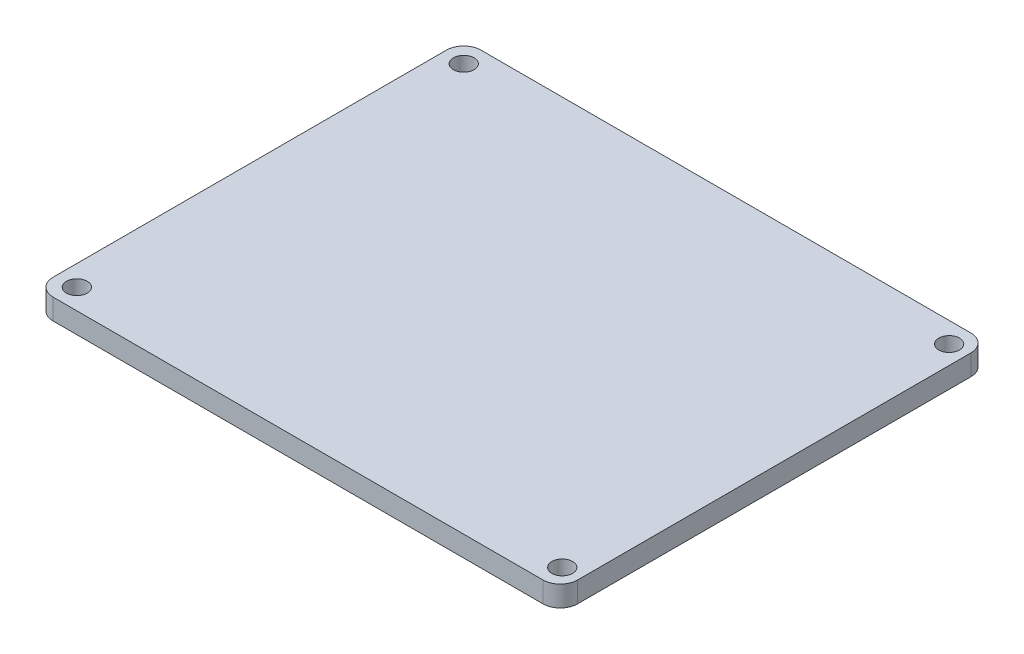
ISO-10303-21;
HEADER;
FILE_DESCRIPTION(('STEP AP214'),'2;1');
FILE_NAME('part.step','',(''),(''),'','','');
FILE_SCHEMA(('AUTOMOTIVE_DESIGN { 1 0 10303 214 1 1 1 1 }'));
ENDSEC;
DATA;
#1=APPLICATION_CONTEXT('core data for automotive mechanical design processes');
#2=APPLICATION_PROTOCOL_DEFINITION('international standard','automotive_design',2000,#1);
#3=PRODUCT_CONTEXT('',#1,'mechanical');
#4=PRODUCT('Part','Part','',(#3));
#5=PRODUCT_RELATED_PRODUCT_CATEGORY('part','',(#4));
#6=PRODUCT_DEFINITION_FORMATION('','',#4);
#7=PRODUCT_DEFINITION_CONTEXT('part definition',#1,'design');
#8=PRODUCT_DEFINITION('design','',#6,#7);
#9=PRODUCT_DEFINITION_SHAPE('','',#8);
#10=(LENGTH_UNIT() NAMED_UNIT(*) SI_UNIT(.MILLI.,.METRE.));
#11=(NAMED_UNIT(*) PLANE_ANGLE_UNIT() SI_UNIT($,.RADIAN.));
#12=(NAMED_UNIT(*) SI_UNIT($,.STERADIAN.) SOLID_ANGLE_UNIT());
#13=UNCERTAINTY_MEASURE_WITH_UNIT(LENGTH_MEASURE(1.E-05),#10,'distance_accuracy_value','');
#14=(GEOMETRIC_REPRESENTATION_CONTEXT(3) GLOBAL_UNCERTAINTY_ASSIGNED_CONTEXT((#13)) GLOBAL_UNIT_ASSIGNED_CONTEXT((#10,
#11,#12)) REPRESENTATION_CONTEXT('',''));
#15=CARTESIAN_POINT('',(0.,0.,0.));
#16=DIRECTION('',(0.,0.,1.));
#17=DIRECTION('',(1.,0.,0.));
#18=AXIS2_PLACEMENT_3D('',#15,#16,#17);
#19=CARTESIAN_POINT('',(-35.6428674078408,3.,28.5));
#20=DIRECTION('',(0.,1.,0.));
#21=DIRECTION('',(0.,0.,1.));
#22=AXIS2_PLACEMENT_3D('',#19,#20,#21);
#23=PLANE('',#22);
#24=CARTESIAN_POINT('',(35.1695408590477,3.,28.034184865455));
#25=DIRECTION('',(0.,1.,0.));
#26=DIRECTION('',(0.,0.,1.));
#27=AXIS2_PLACEMENT_3D('',#24,#25,#26);
#28=CIRCLE('',#27,1.5);
#29=CARTESIAN_POINT('',(35.1695408590477,3.,29.534184865455));
#30=VERTEX_POINT('',#29);
#31=EDGE_CURVE('E187',#30,#30,#28,.T.);
#32=ORIENTED_EDGE('',*,*,#31,.F.);
#33=EDGE_LOOP('',(#32));
#34=FACE_BOUND('',#33,.T.);
#35=CARTESIAN_POINT('',(-35.1695408590477,3.,-28.034184865455));
#36=DIRECTION('',(0.,1.,0.));
#37=DIRECTION('',(0.,0.,1.));
#38=AXIS2_PLACEMENT_3D('',#35,#36,#37);
#39=CIRCLE('',#38,1.5);
#40=CARTESIAN_POINT('',(-35.1695408590477,3.,-26.534184865455));
#41=VERTEX_POINT('',#40);
#42=EDGE_CURVE('E133',#41,#41,#39,.T.);
#43=ORIENTED_EDGE('',*,*,#42,.F.);
#44=EDGE_LOOP('',(#43));
#45=FACE_BOUND('',#44,.T.);
#46=CARTESIAN_POINT('',(-35.6428674078408,3.,28.5));
#47=DIRECTION('',(0.,1.,0.));
#48=DIRECTION('',(0.,0.,1.));
#49=AXIS2_PLACEMENT_3D('',#46,#47,#48);
#50=CIRCLE('',#49,2.5);
#51=CARTESIAN_POINT('',(-38.1428674078408,3.,28.5));
#52=VERTEX_POINT('',#51);
#53=CARTESIAN_POINT('',(-35.6428674078408,3.,31.));
#54=VERTEX_POINT('',#53);
#55=EDGE_CURVE('E144',#52,#54,#50,.T.);
#56=ORIENTED_EDGE('',*,*,#55,.T.);
#57=DIRECTION('',(1.,0.,0.));
#58=VECTOR('',#57,1.);
#59=CARTESIAN_POINT('',(-35.6428674078408,3.,31.));
#60=LINE('',#59,#58);
#61=CARTESIAN_POINT('',(35.3571325921592,3.,31.));
#62=VERTEX_POINT('',#61);
#63=EDGE_CURVE('E92',#54,#62,#60,.T.);
#64=ORIENTED_EDGE('',*,*,#63,.T.);
#65=CARTESIAN_POINT('',(35.3571325921592,3.,28.5));
#66=DIRECTION('',(0.,1.,0.));
#67=DIRECTION('',(0.,0.,1.));
#68=AXIS2_PLACEMENT_3D('',#65,#66,#67);
#69=CIRCLE('',#68,2.5);
#70=CARTESIAN_POINT('',(37.8571325921592,3.,28.5));
#71=VERTEX_POINT('',#70);
#72=EDGE_CURVE('E159',#62,#71,#69,.T.);
#73=ORIENTED_EDGE('',*,*,#72,.T.);
#74=DIRECTION('',(0.,0.,-1.));
#75=VECTOR('',#74,1.);
#76=CARTESIAN_POINT('',(37.8571325921592,3.,-28.5));
#77=LINE('',#76,#75);
#78=CARTESIAN_POINT('',(37.8571325921592,3.,-28.5));
#79=VERTEX_POINT('',#78);
#80=EDGE_CURVE('E172',#71,#79,#77,.T.);
#81=ORIENTED_EDGE('',*,*,#80,.T.);
#82=CARTESIAN_POINT('',(35.3571325921592,3.,-28.5));
#83=DIRECTION('',(0.,1.,0.));
#84=DIRECTION('',(0.,0.,-1.));
#85=AXIS2_PLACEMENT_3D('',#82,#83,#84);
#86=CIRCLE('',#85,2.5);
#87=CARTESIAN_POINT('',(35.3571325921592,3.,-31.));
#88=VERTEX_POINT('',#87);
#89=EDGE_CURVE('E111',#79,#88,#86,.T.);
#90=ORIENTED_EDGE('',*,*,#89,.T.);
#91=DIRECTION('',(-1.,0.,0.));
#92=VECTOR('',#91,1.);
#93=CARTESIAN_POINT('',(-35.6428674078408,3.,-31.));
#94=LINE('',#93,#92);
#95=CARTESIAN_POINT('',(-35.6428674078408,3.,-31.));
#96=VERTEX_POINT('',#95);
#97=EDGE_CURVE('E105',#88,#96,#94,.T.);
#98=ORIENTED_EDGE('',*,*,#97,.T.);
#99=CARTESIAN_POINT('',(-35.6428674078408,3.,-28.5));
#100=DIRECTION('',(0.,1.,0.));
#101=DIRECTION('',(0.,0.,1.));
#102=AXIS2_PLACEMENT_3D('',#99,#100,#101);
#103=CIRCLE('',#102,2.5);
#104=CARTESIAN_POINT('',(-38.1428674078408,3.,-28.5));
#105=VERTEX_POINT('',#104);
#106=EDGE_CURVE('E109',#96,#105,#103,.T.);
#107=ORIENTED_EDGE('',*,*,#106,.T.);
#108=DIRECTION('',(0.,0.,1.));
#109=VECTOR('',#108,1.);
#110=CARTESIAN_POINT('',(-38.1428674078408,3.,-28.5));
#111=LINE('',#110,#109);
#112=EDGE_CURVE('E49',#105,#52,#111,.T.);
#113=ORIENTED_EDGE('',*,*,#112,.T.);
#114=EDGE_LOOP('',(#56,#64,#73,#81,#90,#98,#107,#113));
#115=FACE_BOUND('',#114,.T.);
#116=CARTESIAN_POINT('',(35.1695408590477,3.,-28.034184865455));
#117=DIRECTION('',(0.,1.,0.));
#118=DIRECTION('',(0.,0.,-1.));
#119=AXIS2_PLACEMENT_3D('',#116,#117,#118);
#120=CIRCLE('',#119,1.5);
#121=CARTESIAN_POINT('',(35.1695408590477,3.,-29.534184865455));
#122=VERTEX_POINT('',#121);
#123=EDGE_CURVE('E181',#122,#122,#120,.T.);
#124=ORIENTED_EDGE('',*,*,#123,.F.);
#125=EDGE_LOOP('',(#124));
#126=FACE_BOUND('',#125,.T.);
#127=CARTESIAN_POINT('',(-35.1695408590477,3.,28.034184865455));
#128=DIRECTION('',(0.,1.,0.));
#129=DIRECTION('',(0.,0.,-1.));
#130=AXIS2_PLACEMENT_3D('',#127,#128,#129);
#131=CIRCLE('',#130,1.5);
#132=CARTESIAN_POINT('',(-35.1695408590477,3.,26.534184865455));
#133=VERTEX_POINT('',#132);
#134=EDGE_CURVE('E193',#133,#133,#131,.T.);
#135=ORIENTED_EDGE('',*,*,#134,.F.);
#136=EDGE_LOOP('',(#135));
#137=FACE_BOUND('',#136,.T.);
#138=ADVANCED_FACE('F32',(#34,#45,#115,#126,#137),#23,.T.);
#139=CARTESIAN_POINT('',(-35.6428674078408,0.,28.5));
#140=DIRECTION('',(0.,1.,0.));
#141=DIRECTION('',(0.,0.,1.));
#142=AXIS2_PLACEMENT_3D('',#139,#140,#141);
#143=PLANE('',#142);
#144=CARTESIAN_POINT('',(-35.6428674078408,0.,28.5));
#145=DIRECTION('',(0.,1.,0.));
#146=DIRECTION('',(0.,0.,1.));
#147=AXIS2_PLACEMENT_3D('',#144,#145,#146);
#148=CIRCLE('',#147,2.5);
#149=CARTESIAN_POINT('',(-38.1428674078408,0.,28.5));
#150=VERTEX_POINT('',#149);
#151=CARTESIAN_POINT('',(-35.6428674078408,0.,31.));
#152=VERTEX_POINT('',#151);
#153=EDGE_CURVE('E129',#150,#152,#148,.T.);
#154=ORIENTED_EDGE('',*,*,#153,.F.);
#155=DIRECTION('',(0.,0.,1.));
#156=VECTOR('',#155,1.);
#157=CARTESIAN_POINT('',(-38.1428674078408,0.,-28.5));
#158=LINE('',#157,#156);
#159=CARTESIAN_POINT('',(-38.1428674078408,0.,-28.5));
#160=VERTEX_POINT('',#159);
#161=EDGE_CURVE('E84',#160,#150,#158,.T.);
#162=ORIENTED_EDGE('',*,*,#161,.F.);
#163=CARTESIAN_POINT('',(-35.6428674078408,0.,-28.5));
#164=DIRECTION('',(0.,1.,0.));
#165=DIRECTION('',(0.,0.,1.));
#166=AXIS2_PLACEMENT_3D('',#163,#164,#165);
#167=CIRCLE('',#166,2.5);
#168=CARTESIAN_POINT('',(-35.6428674078408,0.,-31.));
#169=VERTEX_POINT('',#168);
#170=EDGE_CURVE('E78',#169,#160,#167,.T.);
#171=ORIENTED_EDGE('',*,*,#170,.F.);
#172=DIRECTION('',(-1.,0.,0.));
#173=VECTOR('',#172,1.);
#174=CARTESIAN_POINT('',(-35.6428674078408,0.,-31.));
#175=LINE('',#174,#173);
#176=CARTESIAN_POINT('',(35.3571325921592,0.,-31.));
#177=VERTEX_POINT('',#176);
#178=EDGE_CURVE('E119',#177,#169,#175,.T.);
#179=ORIENTED_EDGE('',*,*,#178,.F.);
#180=CARTESIAN_POINT('',(35.3571325921592,0.,-28.5));
#181=DIRECTION('',(0.,1.,0.));
#182=DIRECTION('',(0.,0.,-1.));
#183=AXIS2_PLACEMENT_3D('',#180,#181,#182);
#184=CIRCLE('',#183,2.5);
#185=CARTESIAN_POINT('',(37.8571325921592,0.,-28.5));
#186=VERTEX_POINT('',#185);
#187=EDGE_CURVE('E139',#186,#177,#184,.T.);
#188=ORIENTED_EDGE('',*,*,#187,.F.);
#189=DIRECTION('',(0.,0.,-1.));
#190=VECTOR('',#189,1.);
#191=CARTESIAN_POINT('',(37.8571325921592,0.,-28.5));
#192=LINE('',#191,#190);
#193=CARTESIAN_POINT('',(37.8571325921592,0.,28.5));
#194=VERTEX_POINT('',#193);
#195=EDGE_CURVE('E137',#194,#186,#192,.T.);
#196=ORIENTED_EDGE('',*,*,#195,.F.);
#197=CARTESIAN_POINT('',(35.3571325921592,0.,28.5));
#198=DIRECTION('',(0.,1.,0.));
#199=DIRECTION('',(0.,0.,1.));
#200=AXIS2_PLACEMENT_3D('',#197,#198,#199);
#201=CIRCLE('',#200,2.5);
#202=CARTESIAN_POINT('',(35.3571325921592,0.,31.));
#203=VERTEX_POINT('',#202);
#204=EDGE_CURVE('E135',#203,#194,#201,.T.);
#205=ORIENTED_EDGE('',*,*,#204,.F.);
#206=DIRECTION('',(1.,0.,0.));
#207=VECTOR('',#206,1.);
#208=CARTESIAN_POINT('',(-35.6428674078408,0.,31.));
#209=LINE('',#208,#207);
#210=EDGE_CURVE('E132',#152,#203,#209,.T.);
#211=ORIENTED_EDGE('',*,*,#210,.F.);
#212=EDGE_LOOP('',(#154,#162,#171,#179,#188,#196,#205,#211));
#213=FACE_BOUND('',#212,.T.);
#214=CARTESIAN_POINT('',(-35.1695408590477,0.,-28.034184865455));
#215=DIRECTION('',(0.,1.,0.));
#216=DIRECTION('',(0.,0.,1.));
#217=AXIS2_PLACEMENT_3D('',#214,#215,#216);
#218=CIRCLE('',#217,1.5);
#219=CARTESIAN_POINT('',(-35.1695408590477,0.,-26.534184865455));
#220=VERTEX_POINT('',#219);
#221=EDGE_CURVE('E178',#220,#220,#218,.T.);
#222=ORIENTED_EDGE('',*,*,#221,.T.);
#223=EDGE_LOOP('',(#222));
#224=FACE_BOUND('',#223,.T.);
#225=CARTESIAN_POINT('',(35.1695408590477,0.,-28.034184865455));
#226=DIRECTION('',(0.,1.,0.));
#227=DIRECTION('',(0.,0.,-1.));
#228=AXIS2_PLACEMENT_3D('',#225,#226,#227);
#229=CIRCLE('',#228,1.5);
#230=CARTESIAN_POINT('',(35.1695408590477,0.,-29.534184865455));
#231=VERTEX_POINT('',#230);
#232=EDGE_CURVE('E184',#231,#231,#229,.T.);
#233=ORIENTED_EDGE('',*,*,#232,.T.);
#234=EDGE_LOOP('',(#233));
#235=FACE_BOUND('',#234,.T.);
#236=CARTESIAN_POINT('',(35.1695408590477,0.,28.034184865455));
#237=DIRECTION('',(0.,1.,0.));
#238=DIRECTION('',(0.,0.,1.));
#239=AXIS2_PLACEMENT_3D('',#236,#237,#238);
#240=CIRCLE('',#239,1.5);
#241=CARTESIAN_POINT('',(35.1695408590477,0.,29.534184865455));
#242=VERTEX_POINT('',#241);
#243=EDGE_CURVE('E190',#242,#242,#240,.T.);
#244=ORIENTED_EDGE('',*,*,#243,.T.);
#245=EDGE_LOOP('',(#244));
#246=FACE_BOUND('',#245,.T.);
#247=CARTESIAN_POINT('',(-35.1695408590477,0.,28.034184865455));
#248=DIRECTION('',(0.,1.,0.));
#249=DIRECTION('',(0.,0.,-1.));
#250=AXIS2_PLACEMENT_3D('',#247,#248,#249);
#251=CIRCLE('',#250,1.5);
#252=CARTESIAN_POINT('',(-35.1695408590477,0.,26.534184865455));
#253=VERTEX_POINT('',#252);
#254=EDGE_CURVE('E196',#253,#253,#251,.T.);
#255=ORIENTED_EDGE('',*,*,#254,.T.);
#256=EDGE_LOOP('',(#255));
#257=FACE_BOUND('',#256,.T.);
#258=ADVANCED_FACE('F163',(#213,#224,#235,#246,#257),#143,.F.);
#259=CARTESIAN_POINT('',(-35.6428674078408,3.,28.5));
#260=DIRECTION('',(0.,-1.,0.));
#261=DIRECTION('',(0.,0.,-1.));
#262=AXIS2_PLACEMENT_3D('',#259,#260,#261);
#263=CYLINDRICAL_SURFACE('',#262,2.5);
#264=ORIENTED_EDGE('',*,*,#153,.T.);
#265=DIRECTION('',(0.,-1.,0.));
#266=VECTOR('',#265,1.);
#267=CARTESIAN_POINT('',(-35.6428674078408,3.,31.));
#268=LINE('',#267,#266);
#269=EDGE_CURVE('E11',#54,#152,#268,.T.);
#270=ORIENTED_EDGE('',*,*,#269,.F.);
#271=ORIENTED_EDGE('',*,*,#55,.F.);
#272=DIRECTION('',(0.,-1.,0.));
#273=VECTOR('',#272,1.);
#274=CARTESIAN_POINT('',(-38.1428674078408,3.,28.5));
#275=LINE('',#274,#273);
#276=EDGE_CURVE('E125',#52,#150,#275,.T.);
#277=ORIENTED_EDGE('',*,*,#276,.T.);
#278=EDGE_LOOP('',(#264,#270,#271,#277));
#279=FACE_BOUND('',#278,.T.);
#280=ADVANCED_FACE('F34',(#279),#263,.T.);
#281=CARTESIAN_POINT('',(-35.6428674078408,3.,31.));
#282=DIRECTION('',(0.,0.,-1.));
#283=DIRECTION('',(-1.,0.,0.));
#284=AXIS2_PLACEMENT_3D('',#281,#282,#283);
#285=PLANE('',#284);
#286=ORIENTED_EDGE('',*,*,#210,.T.);
#287=DIRECTION('',(0.,-1.,0.));
#288=VECTOR('',#287,1.);
#289=CARTESIAN_POINT('',(35.3571325921592,3.,31.));
#290=LINE('',#289,#288);
#291=EDGE_CURVE('E41',#62,#203,#290,.T.);
#292=ORIENTED_EDGE('',*,*,#291,.F.);
#293=ORIENTED_EDGE('',*,*,#63,.F.);
#294=ORIENTED_EDGE('',*,*,#269,.T.);
#295=EDGE_LOOP('',(#286,#292,#293,#294));
#296=FACE_BOUND('',#295,.T.);
#297=ADVANCED_FACE('F230',(#296),#285,.F.);
#298=CARTESIAN_POINT('',(35.3571325921592,3.,28.5));
#299=DIRECTION('',(0.,-1.,0.));
#300=DIRECTION('',(0.,0.,-1.));
#301=AXIS2_PLACEMENT_3D('',#298,#299,#300);
#302=CYLINDRICAL_SURFACE('',#301,2.5);
#303=ORIENTED_EDGE('',*,*,#204,.T.);
#304=DIRECTION('',(0.,-1.,0.));
#305=VECTOR('',#304,1.);
#306=CARTESIAN_POINT('',(37.8571325921592,3.,28.5));
#307=LINE('',#306,#305);
#308=EDGE_CURVE('E151',#71,#194,#307,.T.);
#309=ORIENTED_EDGE('',*,*,#308,.F.);
#310=ORIENTED_EDGE('',*,*,#72,.F.);
#311=ORIENTED_EDGE('',*,*,#291,.T.);
#312=EDGE_LOOP('',(#303,#309,#310,#311));
#313=FACE_BOUND('',#312,.T.);
#314=ADVANCED_FACE('F157',(#313),#302,.T.);
#315=CARTESIAN_POINT('',(37.8571325921592,3.,-28.5));
#316=DIRECTION('',(-1.,0.,0.));
#317=DIRECTION('',(0.,0.,1.));
#318=AXIS2_PLACEMENT_3D('',#315,#316,#317);
#319=PLANE('',#318);
#320=ORIENTED_EDGE('',*,*,#195,.T.);
#321=DIRECTION('',(0.,-1.,0.));
#322=VECTOR('',#321,1.);
#323=CARTESIAN_POINT('',(37.8571325921592,3.,-28.5));
#324=LINE('',#323,#322);
#325=EDGE_CURVE('E148',#79,#186,#324,.T.);
#326=ORIENTED_EDGE('',*,*,#325,.F.);
#327=ORIENTED_EDGE('',*,*,#80,.F.);
#328=ORIENTED_EDGE('',*,*,#308,.T.);
#329=EDGE_LOOP('',(#320,#326,#327,#328));
#330=FACE_BOUND('',#329,.T.);
#331=ADVANCED_FACE('F168',(#330),#319,.F.);
#332=CARTESIAN_POINT('',(35.3571325921592,3.,-28.5));
#333=DIRECTION('',(0.,-1.,0.));
#334=DIRECTION('',(0.,0.,-1.));
#335=AXIS2_PLACEMENT_3D('',#332,#333,#334);
#336=CYLINDRICAL_SURFACE('',#335,2.5);
#337=ORIENTED_EDGE('',*,*,#187,.T.);
#338=DIRECTION('',(0.,-1.,0.));
#339=VECTOR('',#338,1.);
#340=CARTESIAN_POINT('',(35.3571325921592,3.,-31.));
#341=LINE('',#340,#339);
#342=EDGE_CURVE('E120',#88,#177,#341,.T.);
#343=ORIENTED_EDGE('',*,*,#342,.F.);
#344=ORIENTED_EDGE('',*,*,#89,.F.);
#345=ORIENTED_EDGE('',*,*,#325,.T.);
#346=EDGE_LOOP('',(#337,#343,#344,#345));
#347=FACE_BOUND('',#346,.T.);
#348=ADVANCED_FACE('F171',(#347),#336,.T.);
#349=CARTESIAN_POINT('',(-35.6428674078408,3.,-31.));
#350=DIRECTION('',(0.,0.,1.));
#351=DIRECTION('',(1.,0.,0.));
#352=AXIS2_PLACEMENT_3D('',#349,#350,#351);
#353=PLANE('',#352);
#354=ORIENTED_EDGE('',*,*,#178,.T.);
#355=DIRECTION('',(0.,-1.,0.));
#356=VECTOR('',#355,1.);
#357=CARTESIAN_POINT('',(-35.6428674078408,3.,-31.));
#358=LINE('',#357,#356);
#359=EDGE_CURVE('E116',#96,#169,#358,.T.);
#360=ORIENTED_EDGE('',*,*,#359,.F.);
#361=ORIENTED_EDGE('',*,*,#97,.F.);
#362=ORIENTED_EDGE('',*,*,#342,.T.);
#363=EDGE_LOOP('',(#354,#360,#361,#362));
#364=FACE_BOUND('',#363,.T.);
#365=ADVANCED_FACE('F117',(#364),#353,.F.);
#366=CARTESIAN_POINT('',(-35.6428674078408,3.,-28.5));
#367=DIRECTION('',(0.,-1.,0.));
#368=DIRECTION('',(0.,0.,-1.));
#369=AXIS2_PLACEMENT_3D('',#366,#367,#368);
#370=CYLINDRICAL_SURFACE('',#369,2.5);
#371=ORIENTED_EDGE('',*,*,#170,.T.);
#372=DIRECTION('',(0.,-1.,0.));
#373=VECTOR('',#372,1.);
#374=CARTESIAN_POINT('',(-38.1428674078408,3.,-28.5));
#375=LINE('',#374,#373);
#376=EDGE_CURVE('E121',#105,#160,#375,.T.);
#377=ORIENTED_EDGE('',*,*,#376,.F.);
#378=ORIENTED_EDGE('',*,*,#106,.F.);
#379=ORIENTED_EDGE('',*,*,#359,.T.);
#380=EDGE_LOOP('',(#371,#377,#378,#379));
#381=FACE_BOUND('',#380,.T.);
#382=ADVANCED_FACE('F123',(#381),#370,.T.);
#383=CARTESIAN_POINT('',(-38.1428674078408,3.,-28.5));
#384=DIRECTION('',(1.,0.,0.));
#385=DIRECTION('',(0.,0.,-1.));
#386=AXIS2_PLACEMENT_3D('',#383,#384,#385);
#387=PLANE('',#386);
#388=ORIENTED_EDGE('',*,*,#161,.T.);
#389=ORIENTED_EDGE('',*,*,#276,.F.);
#390=ORIENTED_EDGE('',*,*,#112,.F.);
#391=ORIENTED_EDGE('',*,*,#376,.T.);
#392=EDGE_LOOP('',(#388,#389,#390,#391));
#393=FACE_BOUND('',#392,.T.);
#394=ADVANCED_FACE('F218',(#393),#387,.F.);
#395=CARTESIAN_POINT('',(-35.1695408590477,3.,-28.034184865455));
#396=DIRECTION('',(0.,-1.,0.));
#397=DIRECTION('',(0.,0.,-1.));
#398=AXIS2_PLACEMENT_3D('',#395,#396,#397);
#399=CYLINDRICAL_SURFACE('',#398,1.5);
#400=ORIENTED_EDGE('',*,*,#42,.T.);
#401=EDGE_LOOP('',(#400));
#402=FACE_BOUND('',#401,.T.);
#403=ORIENTED_EDGE('',*,*,#221,.F.);
#404=EDGE_LOOP('',(#403));
#405=FACE_BOUND('',#404,.T.);
#406=ADVANCED_FACE('F215',(#402,#405),#399,.F.);
#407=CARTESIAN_POINT('',(35.1695408590477,3.,-28.034184865455));
#408=DIRECTION('',(0.,-1.,0.));
#409=DIRECTION('',(0.,0.,-1.));
#410=AXIS2_PLACEMENT_3D('',#407,#408,#409);
#411=CYLINDRICAL_SURFACE('',#410,1.5);
#412=ORIENTED_EDGE('',*,*,#123,.T.);
#413=EDGE_LOOP('',(#412));
#414=FACE_BOUND('',#413,.T.);
#415=ORIENTED_EDGE('',*,*,#232,.F.);
#416=EDGE_LOOP('',(#415));
#417=FACE_BOUND('',#416,.T.);
#418=ADVANCED_FACE('F294',(#414,#417),#411,.F.);
#419=CARTESIAN_POINT('',(35.1695408590477,3.,28.034184865455));
#420=DIRECTION('',(0.,-1.,0.));
#421=DIRECTION('',(0.,0.,-1.));
#422=AXIS2_PLACEMENT_3D('',#419,#420,#421);
#423=CYLINDRICAL_SURFACE('',#422,1.5);
#424=ORIENTED_EDGE('',*,*,#31,.T.);
#425=EDGE_LOOP('',(#424));
#426=FACE_BOUND('',#425,.T.);
#427=ORIENTED_EDGE('',*,*,#243,.F.);
#428=EDGE_LOOP('',(#427));
#429=FACE_BOUND('',#428,.T.);
#430=ADVANCED_FACE('F302',(#426,#429),#423,.F.);
#431=CARTESIAN_POINT('',(-35.1695408590477,3.,28.034184865455));
#432=DIRECTION('',(0.,-1.,0.));
#433=DIRECTION('',(0.,0.,-1.));
#434=AXIS2_PLACEMENT_3D('',#431,#432,#433);
#435=CYLINDRICAL_SURFACE('',#434,1.5);
#436=ORIENTED_EDGE('',*,*,#134,.T.);
#437=EDGE_LOOP('',(#436));
#438=FACE_BOUND('',#437,.T.);
#439=ORIENTED_EDGE('',*,*,#254,.F.);
#440=EDGE_LOOP('',(#439));
#441=FACE_BOUND('',#440,.T.);
#442=ADVANCED_FACE('F202',(#438,#441),#435,.F.);
#443=CLOSED_SHELL('',(#138,#258,#280,#297,#314,#331,#348,#365,#382,#394,#406,#418,#430,#442));
#444=MANIFOLD_SOLID_BREP('B2',#443);
#445=ADVANCED_BREP_SHAPE_REPRESENTATION('',(#18,#444),#14);
#446=SHAPE_DEFINITION_REPRESENTATION(#9,#445);
ENDSEC;
END-ISO-10303-21;
